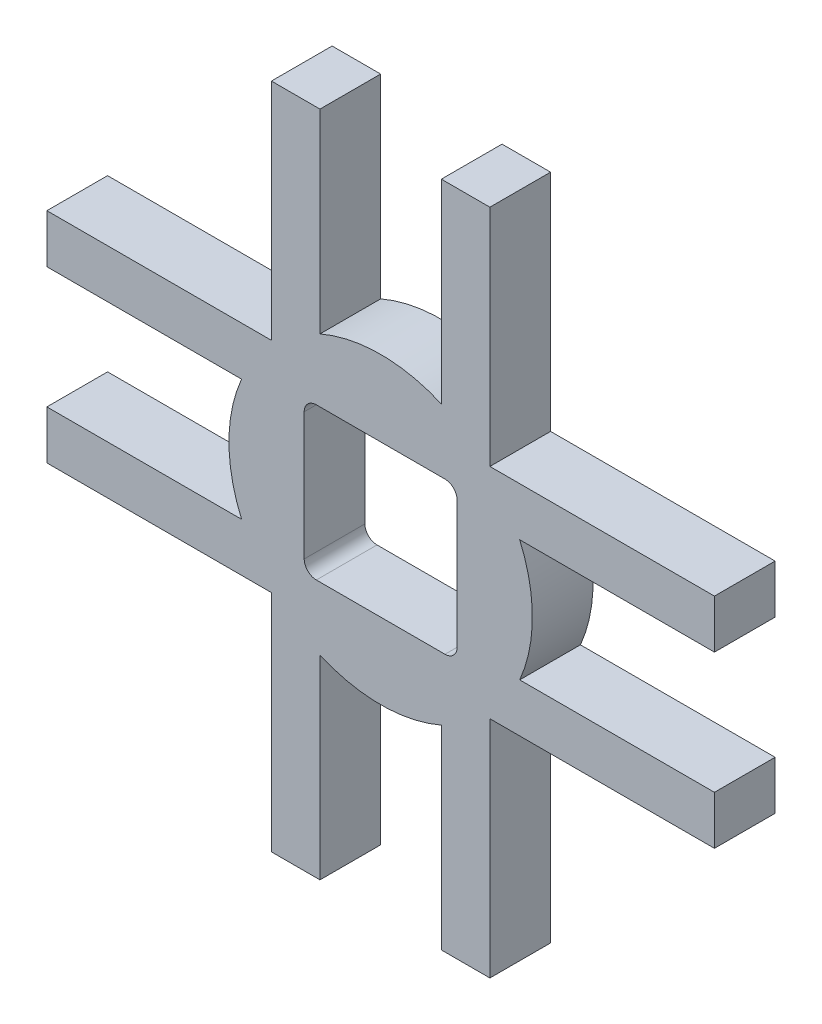
ISO-10303-21;
HEADER;
FILE_DESCRIPTION(('STEP AP214'),'2;1');
FILE_NAME('part.step','',(''),(''),'','','');
FILE_SCHEMA(('AUTOMOTIVE_DESIGN { 1 0 10303 214 1 1 1 1 }'));
ENDSEC;
DATA;
#1=APPLICATION_CONTEXT('core data for automotive mechanical design processes');
#2=APPLICATION_PROTOCOL_DEFINITION('international standard','automotive_design',2000,#1);
#3=PRODUCT_CONTEXT('',#1,'mechanical');
#4=PRODUCT('Part','Part','',(#3));
#5=PRODUCT_RELATED_PRODUCT_CATEGORY('part','',(#4));
#6=PRODUCT_DEFINITION_FORMATION('','',#4);
#7=PRODUCT_DEFINITION_CONTEXT('part definition',#1,'design');
#8=PRODUCT_DEFINITION('design','',#6,#7);
#9=PRODUCT_DEFINITION_SHAPE('','',#8);
#10=(LENGTH_UNIT() NAMED_UNIT(*) SI_UNIT(.MILLI.,.METRE.));
#11=(NAMED_UNIT(*) PLANE_ANGLE_UNIT() SI_UNIT($,.RADIAN.));
#12=(NAMED_UNIT(*) SI_UNIT($,.STERADIAN.) SOLID_ANGLE_UNIT());
#13=UNCERTAINTY_MEASURE_WITH_UNIT(LENGTH_MEASURE(1.E-05),#10,'distance_accuracy_value','');
#14=(GEOMETRIC_REPRESENTATION_CONTEXT(3) GLOBAL_UNCERTAINTY_ASSIGNED_CONTEXT((#13)) GLOBAL_UNIT_ASSIGNED_CONTEXT((#10,
#11,#12)) REPRESENTATION_CONTEXT('',''));
#15=CARTESIAN_POINT('',(0.,0.,0.));
#16=DIRECTION('',(0.,0.,1.));
#17=DIRECTION('',(1.,0.,0.));
#18=AXIS2_PLACEMENT_3D('',#15,#16,#17);
#19=CARTESIAN_POINT('',(0.,0.,2.5));
#20=DIRECTION('',(0.,0.,-1.));
#21=DIRECTION('',(-1.,0.,0.));
#22=AXIS2_PLACEMENT_3D('',#19,#20,#21);
#23=CYLINDRICAL_SURFACE('',#22,12.5);
#24=CARTESIAN_POINT('',(0.,0.,-2.5));
#25=DIRECTION('',(0.,0.,1.));
#26=DIRECTION('',(1.,0.,0.));
#27=AXIS2_PLACEMENT_3D('',#24,#25,#26);
#28=CIRCLE('',#27,12.5);
#29=CARTESIAN_POINT('',(-5.,-11.4564392373896,-2.5));
#30=VERTEX_POINT('',#29);
#31=CARTESIAN_POINT('',(5.,-11.4564392373896,-2.5));
#32=VERTEX_POINT('',#31);
#33=EDGE_CURVE('E481',#30,#32,#28,.T.);
#34=ORIENTED_EDGE('',*,*,#33,.T.);
#35=DIRECTION('',(0.,0.,-1.));
#36=VECTOR('',#35,1.);
#37=CARTESIAN_POINT('',(5.,-11.4564392373896,2.5));
#38=LINE('',#37,#36);
#39=CARTESIAN_POINT('',(5.,-11.4564392373896,2.5));
#40=VERTEX_POINT('',#39);
#41=EDGE_CURVE('E421',#32,#40,#38,.F.);
#42=ORIENTED_EDGE('',*,*,#41,.T.);
#43=CARTESIAN_POINT('',(0.,0.,2.5));
#44=DIRECTION('',(0.,0.,1.));
#45=DIRECTION('',(1.,0.,0.));
#46=AXIS2_PLACEMENT_3D('',#43,#44,#45);
#47=CIRCLE('',#46,12.5);
#48=CARTESIAN_POINT('',(-5.,-11.4564392373896,2.5));
#49=VERTEX_POINT('',#48);
#50=EDGE_CURVE('E477',#49,#40,#47,.T.);
#51=ORIENTED_EDGE('',*,*,#50,.F.);
#52=DIRECTION('',(0.,0.,-1.));
#53=VECTOR('',#52,1.);
#54=CARTESIAN_POINT('',(-5.,-11.4564392373896,2.5));
#55=LINE('',#54,#53);
#56=EDGE_CURVE('E404',#49,#30,#55,.T.);
#57=ORIENTED_EDGE('',*,*,#56,.T.);
#58=EDGE_LOOP('',(#34,#42,#51,#57));
#59=FACE_BOUND('',#58,.T.);
#60=ADVANCED_FACE('F37',(#59),#23,.T.);
#61=CARTESIAN_POINT('',(-11.4564392373896,4.99999999999996,2.5));
#62=VERTEX_POINT('',#61);
#63=CARTESIAN_POINT('',(-11.4564392373896,-5.00000000000004,2.5));
#64=VERTEX_POINT('',#63);
#65=EDGE_CURVE('E474',#62,#64,#47,.T.);
#66=ORIENTED_EDGE('',*,*,#65,.F.);
#67=DIRECTION('',(0.,0.,-1.));
#68=VECTOR('',#67,1.);
#69=CARTESIAN_POINT('',(-11.4564392373896,4.99999999999996,2.5));
#70=LINE('',#69,#68);
#71=CARTESIAN_POINT('',(-11.4564392373896,4.99999999999996,-2.5));
#72=VERTEX_POINT('',#71);
#73=EDGE_CURVE('E329',#62,#72,#70,.T.);
#74=ORIENTED_EDGE('',*,*,#73,.T.);
#75=CARTESIAN_POINT('',(-11.4564392373896,-5.00000000000004,-2.5));
#76=VERTEX_POINT('',#75);
#77=EDGE_CURVE('E479',#72,#76,#28,.T.);
#78=ORIENTED_EDGE('',*,*,#77,.T.);
#79=DIRECTION('',(0.,0.,-1.));
#80=VECTOR('',#79,1.);
#81=CARTESIAN_POINT('',(-11.4564392373896,-5.00000000000004,2.5));
#82=LINE('',#81,#80);
#83=EDGE_CURVE('E424',#76,#64,#82,.F.);
#84=ORIENTED_EDGE('',*,*,#83,.T.);
#85=EDGE_LOOP('',(#66,#74,#78,#84));
#86=FACE_BOUND('',#85,.T.);
#87=ADVANCED_FACE('F575',(#86),#23,.T.);
#88=CARTESIAN_POINT('',(11.4564392373897,-4.99999999999988,-2.5));
#89=VERTEX_POINT('',#88);
#90=CARTESIAN_POINT('',(11.4564392373896,5.00000000000004,-2.5));
#91=VERTEX_POINT('',#90);
#92=EDGE_CURVE('E482',#89,#91,#28,.T.);
#93=ORIENTED_EDGE('',*,*,#92,.T.);
#94=DIRECTION('',(0.,0.,-1.));
#95=VECTOR('',#94,1.);
#96=CARTESIAN_POINT('',(11.4564392373896,5.00000000000004,2.5));
#97=LINE('',#96,#95);
#98=CARTESIAN_POINT('',(11.4564392373896,5.00000000000004,2.5));
#99=VERTEX_POINT('',#98);
#100=EDGE_CURVE('E327',#91,#99,#97,.F.);
#101=ORIENTED_EDGE('',*,*,#100,.T.);
#102=CARTESIAN_POINT('',(11.4564392373897,-4.99999999999988,2.5));
#103=VERTEX_POINT('',#102);
#104=EDGE_CURVE('E279',#103,#99,#47,.T.);
#105=ORIENTED_EDGE('',*,*,#104,.F.);
#106=DIRECTION('',(0.,0.,-1.));
#107=VECTOR('',#106,1.);
#108=CARTESIAN_POINT('',(11.4564392373897,-4.99999999999988,2.5));
#109=LINE('',#108,#107);
#110=EDGE_CURVE('E418',#103,#89,#109,.T.);
#111=ORIENTED_EDGE('',*,*,#110,.T.);
#112=EDGE_LOOP('',(#93,#101,#105,#111));
#113=FACE_BOUND('',#112,.T.);
#114=ADVANCED_FACE('F581',(#113),#23,.T.);
#115=CARTESIAN_POINT('',(5.,11.4564392373896,2.5));
#116=VERTEX_POINT('',#115);
#117=CARTESIAN_POINT('',(-5.,11.4564392373896,2.5));
#118=VERTEX_POINT('',#117);
#119=EDGE_CURVE('E478',#116,#118,#47,.T.);
#120=ORIENTED_EDGE('',*,*,#119,.F.);
#121=DIRECTION('',(0.,0.,-1.));
#122=VECTOR('',#121,1.);
#123=CARTESIAN_POINT('',(5.,11.4564392373896,2.5));
#124=LINE('',#123,#122);
#125=CARTESIAN_POINT('',(5.,11.4564392373896,-2.5));
#126=VERTEX_POINT('',#125);
#127=EDGE_CURVE('E447',#116,#126,#124,.T.);
#128=ORIENTED_EDGE('',*,*,#127,.T.);
#129=CARTESIAN_POINT('',(-5.,11.4564392373896,-2.5));
#130=VERTEX_POINT('',#129);
#131=EDGE_CURVE('E473',#126,#130,#28,.T.);
#132=ORIENTED_EDGE('',*,*,#131,.T.);
#133=DIRECTION('',(0.,0.,-1.));
#134=VECTOR('',#133,1.);
#135=CARTESIAN_POINT('',(-5.,11.4564392373896,2.5));
#136=LINE('',#135,#134);
#137=EDGE_CURVE('E459',#130,#118,#136,.F.);
#138=ORIENTED_EDGE('',*,*,#137,.T.);
#139=EDGE_LOOP('',(#120,#128,#132,#138));
#140=FACE_BOUND('',#139,.T.);
#141=ADVANCED_FACE('F577',(#140),#23,.T.);
#142=CARTESIAN_POINT('',(0.,0.,2.5));
#143=DIRECTION('',(0.,0.,1.));
#144=DIRECTION('',(1.,0.,0.));
#145=AXIS2_PLACEMENT_3D('',#142,#143,#144);
#146=PLANE('',#145);
#147=DIRECTION('',(0.,1.,0.));
#148=VECTOR('',#147,1.);
#149=CARTESIAN_POINT('',(6.3,6.25,2.5));
#150=LINE('',#149,#148);
#151=CARTESIAN_POINT('',(6.3,-5.25,2.5));
#152=VERTEX_POINT('',#151);
#153=CARTESIAN_POINT('',(6.3,5.25,2.5));
#154=VERTEX_POINT('',#153);
#155=EDGE_CURVE('E538',#152,#154,#150,.T.);
#156=ORIENTED_EDGE('',*,*,#155,.F.);
#157=CARTESIAN_POINT('',(5.3,-5.25,2.5));
#158=DIRECTION('',(0.,0.,1.));
#159=DIRECTION('',(1.,0.,0.));
#160=AXIS2_PLACEMENT_3D('',#157,#158,#159);
#161=CIRCLE('',#160,1.);
#162=CARTESIAN_POINT('',(5.3,-6.25,2.5));
#163=VERTEX_POINT('',#162);
#164=EDGE_CURVE('E52',#152,#163,#161,.F.);
#165=ORIENTED_EDGE('',*,*,#164,.T.);
#166=DIRECTION('',(1.,0.,0.));
#167=VECTOR('',#166,1.);
#168=CARTESIAN_POINT('',(-6.3,-6.25,2.5));
#169=LINE('',#168,#167);
#170=CARTESIAN_POINT('',(-5.3,-6.25,2.5));
#171=VERTEX_POINT('',#170);
#172=EDGE_CURVE('E301',#171,#163,#169,.T.);
#173=ORIENTED_EDGE('',*,*,#172,.F.);
#174=CARTESIAN_POINT('',(-5.3,-5.25,2.5));
#175=DIRECTION('',(0.,0.,1.));
#176=DIRECTION('',(1.,0.,0.));
#177=AXIS2_PLACEMENT_3D('',#174,#175,#176);
#178=CIRCLE('',#177,1.);
#179=CARTESIAN_POINT('',(-6.3,-5.25,2.5));
#180=VERTEX_POINT('',#179);
#181=EDGE_CURVE('E45',#171,#180,#178,.F.);
#182=ORIENTED_EDGE('',*,*,#181,.T.);
#183=DIRECTION('',(0.,-1.,0.));
#184=VECTOR('',#183,1.);
#185=CARTESIAN_POINT('',(-6.3,6.25,2.5));
#186=LINE('',#185,#184);
#187=CARTESIAN_POINT('',(-6.3,5.25,2.5));
#188=VERTEX_POINT('',#187);
#189=EDGE_CURVE('E515',#188,#180,#186,.T.);
#190=ORIENTED_EDGE('',*,*,#189,.F.);
#191=CARTESIAN_POINT('',(-5.3,5.25,2.5));
#192=DIRECTION('',(0.,0.,1.));
#193=DIRECTION('',(1.,0.,0.));
#194=AXIS2_PLACEMENT_3D('',#191,#192,#193);
#195=CIRCLE('',#194,1.);
#196=CARTESIAN_POINT('',(-5.3,6.25,2.5));
#197=VERTEX_POINT('',#196);
#198=EDGE_CURVE('E503',#188,#197,#195,.F.);
#199=ORIENTED_EDGE('',*,*,#198,.T.);
#200=DIRECTION('',(-1.,0.,0.));
#201=VECTOR('',#200,1.);
#202=CARTESIAN_POINT('',(-6.3,6.25,2.5));
#203=LINE('',#202,#201);
#204=CARTESIAN_POINT('',(5.3,6.25,2.5));
#205=VERTEX_POINT('',#204);
#206=EDGE_CURVE('E521',#205,#197,#203,.T.);
#207=ORIENTED_EDGE('',*,*,#206,.F.);
#208=CARTESIAN_POINT('',(5.3,5.25,2.5));
#209=DIRECTION('',(0.,0.,1.));
#210=DIRECTION('',(1.,0.,0.));
#211=AXIS2_PLACEMENT_3D('',#208,#209,#210);
#212=CIRCLE('',#211,1.);
#213=EDGE_CURVE('E507',#205,#154,#212,.F.);
#214=ORIENTED_EDGE('',*,*,#213,.T.);
#215=EDGE_LOOP('',(#156,#165,#173,#182,#190,#199,#207,#214));
#216=FACE_BOUND('',#215,.T.);
#217=DIRECTION('',(1.,0.,0.));
#218=VECTOR('',#217,1.);
#219=CARTESIAN_POINT('',(0.,5.,2.5));
#220=LINE('',#219,#218);
#221=CARTESIAN_POINT('',(-27.5,4.9999999999999,2.5));
#222=VERTEX_POINT('',#221);
#223=EDGE_CURVE('E282',#222,#62,#220,.T.);
#224=ORIENTED_EDGE('',*,*,#223,.T.);
#225=ORIENTED_EDGE('',*,*,#65,.T.);
#226=DIRECTION('',(-1.,0.,0.));
#227=VECTOR('',#226,1.);
#228=CARTESIAN_POINT('',(0.,-5.,2.5));
#229=LINE('',#228,#227);
#230=CARTESIAN_POINT('',(-27.5,-5.0000000000001,2.5));
#231=VERTEX_POINT('',#230);
#232=EDGE_CURVE('E407',#64,#231,#229,.T.);
#233=ORIENTED_EDGE('',*,*,#232,.T.);
#234=DIRECTION('',(0.,-1.,0.));
#235=VECTOR('',#234,1.);
#236=CARTESIAN_POINT('',(-27.5,-9.0000000000001,2.5));
#237=LINE('',#236,#235);
#238=CARTESIAN_POINT('',(-27.5,-9.0000000000001,2.5));
#239=VERTEX_POINT('',#238);
#240=EDGE_CURVE('E409',#231,#239,#237,.T.);
#241=ORIENTED_EDGE('',*,*,#240,.T.);
#242=DIRECTION('',(1.,0.,0.));
#243=VECTOR('',#242,1.);
#244=CARTESIAN_POINT('',(0.,-9.,2.5));
#245=LINE('',#244,#243);
#246=CARTESIAN_POINT('',(-9.,-9.00000000000002,2.5));
#247=VERTEX_POINT('',#246);
#248=EDGE_CURVE('E384',#239,#247,#245,.T.);
#249=ORIENTED_EDGE('',*,*,#248,.T.);
#250=DIRECTION('',(0.,-1.,0.));
#251=VECTOR('',#250,1.);
#252=CARTESIAN_POINT('',(-9.,0.,2.5));
#253=LINE('',#252,#251);
#254=CARTESIAN_POINT('',(-9.,-27.5,2.5));
#255=VERTEX_POINT('',#254);
#256=EDGE_CURVE('E332',#247,#255,#253,.T.);
#257=ORIENTED_EDGE('',*,*,#256,.T.);
#258=DIRECTION('',(1.,0.,0.));
#259=VECTOR('',#258,1.);
#260=CARTESIAN_POINT('',(-9.,-27.5,2.5));
#261=LINE('',#260,#259);
#262=CARTESIAN_POINT('',(-5.,-27.5,2.5));
#263=VERTEX_POINT('',#262);
#264=EDGE_CURVE('E340',#255,#263,#261,.T.);
#265=ORIENTED_EDGE('',*,*,#264,.T.);
#266=DIRECTION('',(0.,1.,0.));
#267=VECTOR('',#266,1.);
#268=CARTESIAN_POINT('',(-5.,0.,2.5));
#269=LINE('',#268,#267);
#270=EDGE_CURVE('E343',#263,#49,#269,.T.);
#271=ORIENTED_EDGE('',*,*,#270,.T.);
#272=ORIENTED_EDGE('',*,*,#50,.T.);
#273=DIRECTION('',(0.,-1.,0.));
#274=VECTOR('',#273,1.);
#275=CARTESIAN_POINT('',(5.,0.,2.5));
#276=LINE('',#275,#274);
#277=CARTESIAN_POINT('',(5.,-27.5,2.5));
#278=VERTEX_POINT('',#277);
#279=EDGE_CURVE('E387',#40,#278,#276,.T.);
#280=ORIENTED_EDGE('',*,*,#279,.T.);
#281=DIRECTION('',(1.,0.,0.));
#282=VECTOR('',#281,1.);
#283=CARTESIAN_POINT('',(9.,-27.5,2.5));
#284=LINE('',#283,#282);
#285=CARTESIAN_POINT('',(9.,-27.5,2.5));
#286=VERTEX_POINT('',#285);
#287=EDGE_CURVE('E389',#278,#286,#284,.T.);
#288=ORIENTED_EDGE('',*,*,#287,.T.);
#289=DIRECTION('',(0.,1.,0.));
#290=VECTOR('',#289,1.);
#291=CARTESIAN_POINT('',(9.,0.,2.5));
#292=LINE('',#291,#290);
#293=CARTESIAN_POINT('',(9.,-8.9999999999999,2.5));
#294=VERTEX_POINT('',#293);
#295=EDGE_CURVE('E375',#286,#294,#292,.T.);
#296=ORIENTED_EDGE('',*,*,#295,.T.);
#297=DIRECTION('',(1.,0.,0.));
#298=VECTOR('',#297,1.);
#299=CARTESIAN_POINT('',(0.,-9.,2.5));
#300=LINE('',#299,#298);
#301=CARTESIAN_POINT('',(27.5000000000001,-8.99999999999971,2.5));
#302=VERTEX_POINT('',#301);
#303=EDGE_CURVE('E354',#294,#302,#300,.T.);
#304=ORIENTED_EDGE('',*,*,#303,.T.);
#305=DIRECTION('',(0.,1.,0.));
#306=VECTOR('',#305,1.);
#307=CARTESIAN_POINT('',(27.5000000000001,-8.99999999999971,2.5));
#308=LINE('',#307,#306);
#309=CARTESIAN_POINT('',(27.5000000000001,-4.99999999999971,2.5));
#310=VERTEX_POINT('',#309);
#311=EDGE_CURVE('E362',#302,#310,#308,.T.);
#312=ORIENTED_EDGE('',*,*,#311,.T.);
#313=DIRECTION('',(-1.,0.,0.));
#314=VECTOR('',#313,1.);
#315=CARTESIAN_POINT('',(0.,-5.,2.5));
#316=LINE('',#315,#314);
#317=EDGE_CURVE('E365',#310,#103,#316,.T.);
#318=ORIENTED_EDGE('',*,*,#317,.T.);
#319=ORIENTED_EDGE('',*,*,#104,.T.);
#320=CARTESIAN_POINT('',(27.4999999999999,5.00000000000029,2.5));
#321=VERTEX_POINT('',#320);
#322=EDGE_CURVE('E270',#99,#321,#220,.T.);
#323=ORIENTED_EDGE('',*,*,#322,.T.);
#324=DIRECTION('',(0.,1.,0.));
#325=VECTOR('',#324,1.);
#326=CARTESIAN_POINT('',(27.4999999999999,9.00000000000029,2.5));
#327=LINE('',#326,#325);
#328=CARTESIAN_POINT('',(27.4999999999999,9.00000000000029,2.5));
#329=VERTEX_POINT('',#328);
#330=EDGE_CURVE('E276',#321,#329,#327,.T.);
#331=ORIENTED_EDGE('',*,*,#330,.T.);
#332=DIRECTION('',(-1.,0.,0.));
#333=VECTOR('',#332,1.);
#334=CARTESIAN_POINT('',(0.,9.,2.5));
#335=LINE('',#334,#333);
#336=CARTESIAN_POINT('',(9.,9.00000000000003,2.5));
#337=VERTEX_POINT('',#336);
#338=EDGE_CURVE('E313',#329,#337,#335,.T.);
#339=ORIENTED_EDGE('',*,*,#338,.T.);
#340=DIRECTION('',(0.,1.,0.));
#341=VECTOR('',#340,1.);
#342=CARTESIAN_POINT('',(9.,0.,2.5));
#343=LINE('',#342,#341);
#344=CARTESIAN_POINT('',(9.,27.5,2.5));
#345=VERTEX_POINT('',#344);
#346=EDGE_CURVE('E427',#337,#345,#343,.T.);
#347=ORIENTED_EDGE('',*,*,#346,.T.);
#348=DIRECTION('',(-1.,0.,0.));
#349=VECTOR('',#348,1.);
#350=CARTESIAN_POINT('',(9.,27.5,2.5));
#351=LINE('',#350,#349);
#352=CARTESIAN_POINT('',(5.,27.5,2.5));
#353=VERTEX_POINT('',#352);
#354=EDGE_CURVE('E436',#345,#353,#351,.T.);
#355=ORIENTED_EDGE('',*,*,#354,.T.);
#356=DIRECTION('',(0.,-1.,0.));
#357=VECTOR('',#356,1.);
#358=CARTESIAN_POINT('',(5.,0.,2.5));
#359=LINE('',#358,#357);
#360=EDGE_CURVE('E439',#353,#116,#359,.T.);
#361=ORIENTED_EDGE('',*,*,#360,.T.);
#362=ORIENTED_EDGE('',*,*,#119,.T.);
#363=DIRECTION('',(0.,1.,0.));
#364=VECTOR('',#363,1.);
#365=CARTESIAN_POINT('',(-5.,0.,2.5));
#366=LINE('',#365,#364);
#367=CARTESIAN_POINT('',(-5.,27.5,2.5));
#368=VERTEX_POINT('',#367);
#369=EDGE_CURVE('E462',#118,#368,#366,.T.);
#370=ORIENTED_EDGE('',*,*,#369,.T.);
#371=DIRECTION('',(-1.,0.,0.));
#372=VECTOR('',#371,1.);
#373=CARTESIAN_POINT('',(-9.,27.5,2.5));
#374=LINE('',#373,#372);
#375=CARTESIAN_POINT('',(-9.,27.5,2.5));
#376=VERTEX_POINT('',#375);
#377=EDGE_CURVE('E464',#368,#376,#374,.T.);
#378=ORIENTED_EDGE('',*,*,#377,.T.);
#379=DIRECTION('',(0.,-1.,0.));
#380=VECTOR('',#379,1.);
#381=CARTESIAN_POINT('',(-9.,0.,2.5));
#382=LINE('',#381,#380);
#383=CARTESIAN_POINT('',(-9.,8.99999999999997,2.5));
#384=VERTEX_POINT('',#383);
#385=EDGE_CURVE('E450',#376,#384,#382,.T.);
#386=ORIENTED_EDGE('',*,*,#385,.T.);
#387=CARTESIAN_POINT('',(-27.5,8.99999999999991,2.5));
#388=VERTEX_POINT('',#387);
#389=EDGE_CURVE('E315',#384,#388,#335,.T.);
#390=ORIENTED_EDGE('',*,*,#389,.T.);
#391=DIRECTION('',(0.,-1.,0.));
#392=VECTOR('',#391,1.);
#393=CARTESIAN_POINT('',(-27.5,8.99999999999991,2.5));
#394=LINE('',#393,#392);
#395=EDGE_CURVE('E283',#388,#222,#394,.T.);
#396=ORIENTED_EDGE('',*,*,#395,.T.);
#397=EDGE_LOOP('',(#224,#225,#233,#241,#249,#257,#265,#271,#272,#280,#288,#296,#304,#312,#318,
#319,#323,#331,#339,#347,#355,#361,#362,#370,#378,#386,#390,#396));
#398=FACE_BOUND('',#397,.T.);
#399=ADVANCED_FACE('F273',(#216,#398),#146,.T.);
#400=CARTESIAN_POINT('',(0.,0.,-2.5));
#401=DIRECTION('',(0.,0.,1.));
#402=DIRECTION('',(1.,0.,0.));
#403=AXIS2_PLACEMENT_3D('',#400,#401,#402);
#404=PLANE('',#403);
#405=DIRECTION('',(-1.,0.,0.));
#406=VECTOR('',#405,1.);
#407=CARTESIAN_POINT('',(-6.3,-6.25,-2.5));
#408=LINE('',#407,#406);
#409=CARTESIAN_POINT('',(5.3,-6.25,-2.5));
#410=VERTEX_POINT('',#409);
#411=CARTESIAN_POINT('',(-5.3,-6.25,-2.5));
#412=VERTEX_POINT('',#411);
#413=EDGE_CURVE('E529',#410,#412,#408,.T.);
#414=ORIENTED_EDGE('',*,*,#413,.F.);
#415=CARTESIAN_POINT('',(5.3,-5.25,-2.5));
#416=DIRECTION('',(0.,0.,1.));
#417=DIRECTION('',(1.,0.,0.));
#418=AXIS2_PLACEMENT_3D('',#415,#416,#417);
#419=CIRCLE('',#418,1.);
#420=CARTESIAN_POINT('',(6.3,-5.25,-2.5));
#421=VERTEX_POINT('',#420);
#422=EDGE_CURVE('E512',#410,#421,#419,.T.);
#423=ORIENTED_EDGE('',*,*,#422,.T.);
#424=DIRECTION('',(0.,-1.,0.));
#425=VECTOR('',#424,1.);
#426=CARTESIAN_POINT('',(6.3,6.25,-2.5));
#427=LINE('',#426,#425);
#428=CARTESIAN_POINT('',(6.3,5.25,-2.5));
#429=VERTEX_POINT('',#428);
#430=EDGE_CURVE('E535',#429,#421,#427,.T.);
#431=ORIENTED_EDGE('',*,*,#430,.F.);
#432=CARTESIAN_POINT('',(5.3,5.25,-2.5));
#433=DIRECTION('',(0.,0.,1.));
#434=DIRECTION('',(1.,0.,0.));
#435=AXIS2_PLACEMENT_3D('',#432,#433,#434);
#436=CIRCLE('',#435,1.);
#437=CARTESIAN_POINT('',(5.3,6.25,-2.5));
#438=VERTEX_POINT('',#437);
#439=EDGE_CURVE('E509',#429,#438,#436,.T.);
#440=ORIENTED_EDGE('',*,*,#439,.T.);
#441=DIRECTION('',(1.,0.,0.));
#442=VECTOR('',#441,1.);
#443=CARTESIAN_POINT('',(-6.3,6.25,-2.5));
#444=LINE('',#443,#442);
#445=CARTESIAN_POINT('',(-5.3,6.25,-2.5));
#446=VERTEX_POINT('',#445);
#447=EDGE_CURVE('E298',#446,#438,#444,.T.);
#448=ORIENTED_EDGE('',*,*,#447,.F.);
#449=CARTESIAN_POINT('',(-5.3,5.25,-2.5));
#450=DIRECTION('',(0.,0.,1.));
#451=DIRECTION('',(1.,0.,0.));
#452=AXIS2_PLACEMENT_3D('',#449,#450,#451);
#453=CIRCLE('',#452,1.);
#454=CARTESIAN_POINT('',(-6.3,5.25,-2.5));
#455=VERTEX_POINT('',#454);
#456=EDGE_CURVE('E505',#446,#455,#453,.T.);
#457=ORIENTED_EDGE('',*,*,#456,.T.);
#458=DIRECTION('',(0.,1.,0.));
#459=VECTOR('',#458,1.);
#460=CARTESIAN_POINT('',(-6.3,6.25,-2.5));
#461=LINE('',#460,#459);
#462=CARTESIAN_POINT('',(-6.3,-5.25,-2.5));
#463=VERTEX_POINT('',#462);
#464=EDGE_CURVE('E531',#463,#455,#461,.T.);
#465=ORIENTED_EDGE('',*,*,#464,.F.);
#466=CARTESIAN_POINT('',(-5.3,-5.25,-2.5));
#467=DIRECTION('',(0.,0.,1.));
#468=DIRECTION('',(1.,0.,0.));
#469=AXIS2_PLACEMENT_3D('',#466,#467,#468);
#470=CIRCLE('',#469,1.);
#471=EDGE_CURVE('E11',#463,#412,#470,.T.);
#472=ORIENTED_EDGE('',*,*,#471,.T.);
#473=EDGE_LOOP('',(#414,#423,#431,#440,#448,#457,#465,#472));
#474=FACE_BOUND('',#473,.T.);
#475=ORIENTED_EDGE('',*,*,#77,.F.);
#476=DIRECTION('',(-1.,0.,0.));
#477=VECTOR('',#476,1.);
#478=CARTESIAN_POINT('',(0.,5.,-2.5));
#479=LINE('',#478,#477);
#480=CARTESIAN_POINT('',(-27.5,4.9999999999999,-2.5));
#481=VERTEX_POINT('',#480);
#482=EDGE_CURVE('E309',#72,#481,#479,.T.);
#483=ORIENTED_EDGE('',*,*,#482,.T.);
#484=DIRECTION('',(0.,1.,0.));
#485=VECTOR('',#484,1.);
#486=CARTESIAN_POINT('',(-27.5,8.99999999999991,-2.5));
#487=LINE('',#486,#485);
#488=CARTESIAN_POINT('',(-27.5,8.99999999999991,-2.5));
#489=VERTEX_POINT('',#488);
#490=EDGE_CURVE('E312',#481,#489,#487,.T.);
#491=ORIENTED_EDGE('',*,*,#490,.T.);
#492=DIRECTION('',(1.,0.,0.));
#493=VECTOR('',#492,1.);
#494=CARTESIAN_POINT('',(0.,9.,-2.5));
#495=LINE('',#494,#493);
#496=CARTESIAN_POINT('',(-9.,9.00000000000029,-2.5));
#497=VERTEX_POINT('',#496);
#498=EDGE_CURVE('E310',#489,#497,#495,.T.);
#499=ORIENTED_EDGE('',*,*,#498,.T.);
#500=DIRECTION('',(0.,1.,0.));
#501=VECTOR('',#500,1.);
#502=CARTESIAN_POINT('',(-9.,0.,-2.5));
#503=LINE('',#502,#501);
#504=CARTESIAN_POINT('',(-9.,27.5,-2.5));
#505=VERTEX_POINT('',#504);
#506=EDGE_CURVE('E457',#497,#505,#503,.T.);
#507=ORIENTED_EDGE('',*,*,#506,.T.);
#508=DIRECTION('',(1.,0.,0.));
#509=VECTOR('',#508,1.);
#510=CARTESIAN_POINT('',(-9.,27.5,-2.5));
#511=LINE('',#510,#509);
#512=CARTESIAN_POINT('',(-5.,27.5,-2.5));
#513=VERTEX_POINT('',#512);
#514=EDGE_CURVE('E454',#505,#513,#511,.T.);
#515=ORIENTED_EDGE('',*,*,#514,.T.);
#516=DIRECTION('',(0.,-1.,0.));
#517=VECTOR('',#516,1.);
#518=CARTESIAN_POINT('',(-5.,0.,-2.5));
#519=LINE('',#518,#517);
#520=EDGE_CURVE('E451',#513,#130,#519,.T.);
#521=ORIENTED_EDGE('',*,*,#520,.T.);
#522=ORIENTED_EDGE('',*,*,#131,.F.);
#523=DIRECTION('',(0.,1.,0.));
#524=VECTOR('',#523,1.);
#525=CARTESIAN_POINT('',(5.,0.,-2.5));
#526=LINE('',#525,#524);
#527=CARTESIAN_POINT('',(5.,27.5,-2.5));
#528=VERTEX_POINT('',#527);
#529=EDGE_CURVE('E428',#126,#528,#526,.T.);
#530=ORIENTED_EDGE('',*,*,#529,.T.);
#531=DIRECTION('',(1.,0.,0.));
#532=VECTOR('',#531,1.);
#533=CARTESIAN_POINT('',(9.,27.5,-2.5));
#534=LINE('',#533,#532);
#535=CARTESIAN_POINT('',(9.,27.5,-2.5));
#536=VERTEX_POINT('',#535);
#537=EDGE_CURVE('E434',#528,#536,#534,.T.);
#538=ORIENTED_EDGE('',*,*,#537,.T.);
#539=DIRECTION('',(0.,-1.,0.));
#540=VECTOR('',#539,1.);
#541=CARTESIAN_POINT('',(9.,0.,-2.5));
#542=LINE('',#541,#540);
#543=CARTESIAN_POINT('',(9.,9.00000000000003,-2.5));
#544=VERTEX_POINT('',#543);
#545=EDGE_CURVE('E430',#536,#544,#542,.T.);
#546=ORIENTED_EDGE('',*,*,#545,.T.);
#547=CARTESIAN_POINT('',(27.4999999999999,9.00000000000029,-2.5));
#548=VERTEX_POINT('',#547);
#549=EDGE_CURVE('E308',#544,#548,#495,.T.);
#550=ORIENTED_EDGE('',*,*,#549,.T.);
#551=DIRECTION('',(0.,-1.,0.));
#552=VECTOR('',#551,1.);
#553=CARTESIAN_POINT('',(27.4999999999999,9.00000000000029,-2.5));
#554=LINE('',#553,#552);
#555=CARTESIAN_POINT('',(27.4999999999999,5.00000000000029,-2.5));
#556=VERTEX_POINT('',#555);
#557=EDGE_CURVE('E305',#548,#556,#554,.T.);
#558=ORIENTED_EDGE('',*,*,#557,.T.);
#559=EDGE_CURVE('E289',#556,#91,#479,.T.);
#560=ORIENTED_EDGE('',*,*,#559,.T.);
#561=ORIENTED_EDGE('',*,*,#92,.F.);
#562=DIRECTION('',(1.,0.,0.));
#563=VECTOR('',#562,1.);
#564=CARTESIAN_POINT('',(0.,-5.,-2.5));
#565=LINE('',#564,#563);
#566=CARTESIAN_POINT('',(27.5000000000001,-4.99999999999971,-2.5));
#567=VERTEX_POINT('',#566);
#568=EDGE_CURVE('E355',#89,#567,#565,.T.);
#569=ORIENTED_EDGE('',*,*,#568,.T.);
#570=DIRECTION('',(0.,-1.,0.));
#571=VECTOR('',#570,1.);
#572=CARTESIAN_POINT('',(27.5000000000001,-8.99999999999971,-2.5));
#573=LINE('',#572,#571);
#574=CARTESIAN_POINT('',(27.5000000000001,-8.99999999999971,-2.5));
#575=VERTEX_POINT('',#574);
#576=EDGE_CURVE('E360',#567,#575,#573,.T.);
#577=ORIENTED_EDGE('',*,*,#576,.T.);
#578=DIRECTION('',(-1.,0.,0.));
#579=VECTOR('',#578,1.);
#580=CARTESIAN_POINT('',(0.,-9.,-2.5));
#581=LINE('',#580,#579);
#582=CARTESIAN_POINT('',(9.,-8.99999999999993,-2.5));
#583=VERTEX_POINT('',#582);
#584=EDGE_CURVE('E357',#575,#583,#581,.T.);
#585=ORIENTED_EDGE('',*,*,#584,.T.);
#586=DIRECTION('',(0.,-1.,0.));
#587=VECTOR('',#586,1.);
#588=CARTESIAN_POINT('',(9.,0.,-2.5));
#589=LINE('',#588,#587);
#590=CARTESIAN_POINT('',(9.,-27.5,-2.5));
#591=VERTEX_POINT('',#590);
#592=EDGE_CURVE('E382',#583,#591,#589,.T.);
#593=ORIENTED_EDGE('',*,*,#592,.T.);
#594=DIRECTION('',(-1.,0.,0.));
#595=VECTOR('',#594,1.);
#596=CARTESIAN_POINT('',(9.,-27.5,-2.5));
#597=LINE('',#596,#595);
#598=CARTESIAN_POINT('',(5.,-27.5,-2.5));
#599=VERTEX_POINT('',#598);
#600=EDGE_CURVE('E379',#591,#599,#597,.T.);
#601=ORIENTED_EDGE('',*,*,#600,.T.);
#602=DIRECTION('',(0.,1.,0.));
#603=VECTOR('',#602,1.);
#604=CARTESIAN_POINT('',(5.,0.,-2.5));
#605=LINE('',#604,#603);
#606=EDGE_CURVE('E376',#599,#32,#605,.T.);
#607=ORIENTED_EDGE('',*,*,#606,.T.);
#608=ORIENTED_EDGE('',*,*,#33,.F.);
#609=DIRECTION('',(0.,-1.,0.));
#610=VECTOR('',#609,1.);
#611=CARTESIAN_POINT('',(-5.,0.,-2.5));
#612=LINE('',#611,#610);
#613=CARTESIAN_POINT('',(-5.,-27.5,-2.5));
#614=VERTEX_POINT('',#613);
#615=EDGE_CURVE('E333',#30,#614,#612,.T.);
#616=ORIENTED_EDGE('',*,*,#615,.T.);
#617=DIRECTION('',(-1.,0.,0.));
#618=VECTOR('',#617,1.);
#619=CARTESIAN_POINT('',(-9.,-27.5,-2.5));
#620=LINE('',#619,#618);
#621=CARTESIAN_POINT('',(-9.,-27.5,-2.5));
#622=VERTEX_POINT('',#621);
#623=EDGE_CURVE('E338',#614,#622,#620,.T.);
#624=ORIENTED_EDGE('',*,*,#623,.T.);
#625=DIRECTION('',(0.,1.,0.));
#626=VECTOR('',#625,1.);
#627=CARTESIAN_POINT('',(-9.,0.,-2.5));
#628=LINE('',#627,#626);
#629=CARTESIAN_POINT('',(-9.,-9.00000000000003,-2.5));
#630=VERTEX_POINT('',#629);
#631=EDGE_CURVE('E335',#622,#630,#628,.T.);
#632=ORIENTED_EDGE('',*,*,#631,.T.);
#633=DIRECTION('',(-1.,0.,0.));
#634=VECTOR('',#633,1.);
#635=CARTESIAN_POINT('',(0.,-9.,-2.5));
#636=LINE('',#635,#634);
#637=CARTESIAN_POINT('',(-27.5,-9.0000000000001,-2.5));
#638=VERTEX_POINT('',#637);
#639=EDGE_CURVE('E402',#630,#638,#636,.T.);
#640=ORIENTED_EDGE('',*,*,#639,.T.);
#641=DIRECTION('',(0.,1.,0.));
#642=VECTOR('',#641,1.);
#643=CARTESIAN_POINT('',(-27.5,-9.0000000000001,-2.5));
#644=LINE('',#643,#642);
#645=CARTESIAN_POINT('',(-27.5,-5.0000000000001,-2.5));
#646=VERTEX_POINT('',#645);
#647=EDGE_CURVE('E399',#638,#646,#644,.T.);
#648=ORIENTED_EDGE('',*,*,#647,.T.);
#649=DIRECTION('',(1.,0.,0.));
#650=VECTOR('',#649,1.);
#651=CARTESIAN_POINT('',(0.,-5.,-2.5));
#652=LINE('',#651,#650);
#653=EDGE_CURVE('E396',#646,#76,#652,.T.);
#654=ORIENTED_EDGE('',*,*,#653,.T.);
#655=EDGE_LOOP('',(#475,#483,#491,#499,#507,#515,#521,#522,#530,#538,#546,#550,#558,#560,#561,
#569,#577,#585,#593,#601,#607,#608,#616,#624,#632,#640,#648,#654));
#656=FACE_BOUND('',#655,.T.);
#657=ADVANCED_FACE('F527',(#474,#656),#404,.F.);
#658=CARTESIAN_POINT('',(-9.,0.,-30.2893864631805));
#659=DIRECTION('',(-1.,0.,0.));
#660=DIRECTION('',(0.,-1.,0.));
#661=AXIS2_PLACEMENT_3D('',#658,#659,#660);
#662=PLANE('',#661);
#663=DIRECTION('',(0.,0.,-1.));
#664=VECTOR('',#663,1.);
#665=CARTESIAN_POINT('',(-9.,8.99999999999997,-30.2893864631805));
#666=LINE('',#665,#664);
#667=EDGE_CURVE('E324',#384,#497,#666,.T.);
#668=ORIENTED_EDGE('',*,*,#667,.F.);
#669=ORIENTED_EDGE('',*,*,#385,.F.);
#670=DIRECTION('',(0.,0.,1.));
#671=VECTOR('',#670,1.);
#672=CARTESIAN_POINT('',(-9.,27.5,-30.2893864631805));
#673=LINE('',#672,#671);
#674=EDGE_CURVE('E455',#505,#376,#673,.T.);
#675=ORIENTED_EDGE('',*,*,#674,.F.);
#676=ORIENTED_EDGE('',*,*,#506,.F.);
#677=EDGE_LOOP('',(#668,#669,#675,#676));
#678=FACE_BOUND('',#677,.T.);
#679=ADVANCED_FACE('F699',(#678),#662,.T.);
#680=CARTESIAN_POINT('',(-5.,0.,-30.2893864631805));
#681=DIRECTION('',(1.,0.,0.));
#682=DIRECTION('',(0.,0.,-1.));
#683=AXIS2_PLACEMENT_3D('',#680,#681,#682);
#684=PLANE('',#683);
#685=ORIENTED_EDGE('',*,*,#137,.F.);
#686=ORIENTED_EDGE('',*,*,#520,.F.);
#687=DIRECTION('',(0.,0.,1.));
#688=VECTOR('',#687,1.);
#689=CARTESIAN_POINT('',(-5.,27.5,-30.2893864631805));
#690=LINE('',#689,#688);
#691=EDGE_CURVE('E467',#513,#368,#690,.T.);
#692=ORIENTED_EDGE('',*,*,#691,.T.);
#693=ORIENTED_EDGE('',*,*,#369,.F.);
#694=EDGE_LOOP('',(#685,#686,#692,#693));
#695=FACE_BOUND('',#694,.T.);
#696=ADVANCED_FACE('F690',(#695),#684,.T.);
#697=CARTESIAN_POINT('',(-9.,27.5,-30.2893864631805));
#698=DIRECTION('',(0.,1.,0.));
#699=DIRECTION('',(0.,0.,1.));
#700=AXIS2_PLACEMENT_3D('',#697,#698,#699);
#701=PLANE('',#700);
#702=ORIENTED_EDGE('',*,*,#514,.F.);
#703=ORIENTED_EDGE('',*,*,#674,.T.);
#704=ORIENTED_EDGE('',*,*,#377,.F.);
#705=ORIENTED_EDGE('',*,*,#691,.F.);
#706=EDGE_LOOP('',(#702,#703,#704,#705));
#707=FACE_BOUND('',#706,.T.);
#708=ADVANCED_FACE('F696',(#707),#701,.T.);
#709=CARTESIAN_POINT('',(9.,0.,-30.2893864631805));
#710=DIRECTION('',(1.,0.,0.));
#711=DIRECTION('',(0.,1.,0.));
#712=AXIS2_PLACEMENT_3D('',#709,#710,#711);
#713=PLANE('',#712);
#714=DIRECTION('',(0.,0.,1.));
#715=VECTOR('',#714,1.);
#716=CARTESIAN_POINT('',(9.,9.00000000000003,-30.2893864631805));
#717=LINE('',#716,#715);
#718=EDGE_CURVE('E476',#544,#337,#717,.T.);
#719=ORIENTED_EDGE('',*,*,#718,.F.);
#720=ORIENTED_EDGE('',*,*,#545,.F.);
#721=DIRECTION('',(0.,0.,1.));
#722=VECTOR('',#721,1.);
#723=CARTESIAN_POINT('',(9.,27.5,-30.2893864631805));
#724=LINE('',#723,#722);
#725=EDGE_CURVE('E442',#536,#345,#724,.T.);
#726=ORIENTED_EDGE('',*,*,#725,.T.);
#727=ORIENTED_EDGE('',*,*,#346,.F.);
#728=EDGE_LOOP('',(#719,#720,#726,#727));
#729=FACE_BOUND('',#728,.T.);
#730=ADVANCED_FACE('F611',(#729),#713,.T.);
#731=CARTESIAN_POINT('',(5.,0.,-30.2893864631805));
#732=DIRECTION('',(-1.,0.,0.));
#733=DIRECTION('',(0.,0.,1.));
#734=AXIS2_PLACEMENT_3D('',#731,#732,#733);
#735=PLANE('',#734);
#736=ORIENTED_EDGE('',*,*,#127,.F.);
#737=ORIENTED_EDGE('',*,*,#360,.F.);
#738=DIRECTION('',(0.,0.,1.));
#739=VECTOR('',#738,1.);
#740=CARTESIAN_POINT('',(5.,27.5,-30.2893864631805));
#741=LINE('',#740,#739);
#742=EDGE_CURVE('E431',#528,#353,#741,.T.);
#743=ORIENTED_EDGE('',*,*,#742,.F.);
#744=ORIENTED_EDGE('',*,*,#529,.F.);
#745=EDGE_LOOP('',(#736,#737,#743,#744));
#746=FACE_BOUND('',#745,.T.);
#747=ADVANCED_FACE('F599',(#746),#735,.T.);
#748=CARTESIAN_POINT('',(9.,27.5,-30.2893864631805));
#749=DIRECTION('',(0.,1.,0.));
#750=DIRECTION('',(0.,0.,1.));
#751=AXIS2_PLACEMENT_3D('',#748,#749,#750);
#752=PLANE('',#751);
#753=ORIENTED_EDGE('',*,*,#537,.F.);
#754=ORIENTED_EDGE('',*,*,#742,.T.);
#755=ORIENTED_EDGE('',*,*,#354,.F.);
#756=ORIENTED_EDGE('',*,*,#725,.F.);
#757=EDGE_LOOP('',(#753,#754,#755,#756));
#758=FACE_BOUND('',#757,.T.);
#759=ADVANCED_FACE('F606',(#758),#752,.T.);
#760=CARTESIAN_POINT('',(-9.,-27.5,-30.2893864631805));
#761=DIRECTION('',(0.,-1.,0.));
#762=DIRECTION('',(0.,0.,-1.));
#763=AXIS2_PLACEMENT_3D('',#760,#761,#762);
#764=PLANE('',#763);
#765=ORIENTED_EDGE('',*,*,#623,.F.);
#766=DIRECTION('',(0.,0.,1.));
#767=VECTOR('',#766,1.);
#768=CARTESIAN_POINT('',(-5.,-27.5,-30.2893864631805));
#769=LINE('',#768,#767);
#770=EDGE_CURVE('E336',#614,#263,#769,.T.);
#771=ORIENTED_EDGE('',*,*,#770,.T.);
#772=ORIENTED_EDGE('',*,*,#264,.F.);
#773=DIRECTION('',(0.,0.,1.));
#774=VECTOR('',#773,1.);
#775=CARTESIAN_POINT('',(-9.,-27.5,-30.2893864631805));
#776=LINE('',#775,#774);
#777=EDGE_CURVE('E346',#622,#255,#776,.T.);
#778=ORIENTED_EDGE('',*,*,#777,.F.);
#779=EDGE_LOOP('',(#765,#771,#772,#778));
#780=FACE_BOUND('',#779,.T.);
#781=ADVANCED_FACE('F652',(#780),#764,.T.);
#782=CARTESIAN_POINT('',(-9.,0.,-30.2893864631805));
#783=DIRECTION('',(-1.,0.,0.));
#784=DIRECTION('',(0.,-1.,0.));
#785=AXIS2_PLACEMENT_3D('',#782,#783,#784);
#786=PLANE('',#785);
#787=ORIENTED_EDGE('',*,*,#256,.F.);
#788=DIRECTION('',(0.,0.,-1.));
#789=VECTOR('',#788,1.);
#790=CARTESIAN_POINT('',(-9.,-9.00000000000003,-30.2893864631805));
#791=LINE('',#790,#789);
#792=EDGE_CURVE('E351',#247,#630,#791,.T.);
#793=ORIENTED_EDGE('',*,*,#792,.T.);
#794=ORIENTED_EDGE('',*,*,#631,.F.);
#795=ORIENTED_EDGE('',*,*,#777,.T.);
#796=EDGE_LOOP('',(#787,#793,#794,#795));
#797=FACE_BOUND('',#796,.T.);
#798=ADVANCED_FACE('F649',(#797),#786,.T.);
#799=CARTESIAN_POINT('',(-27.5,-9.0000000000001,-30.2893864631805));
#800=DIRECTION('',(-1.,0.,0.));
#801=DIRECTION('',(0.,-1.,0.));
#802=AXIS2_PLACEMENT_3D('',#799,#800,#801);
#803=PLANE('',#802);
#804=ORIENTED_EDGE('',*,*,#647,.F.);
#805=DIRECTION('',(0.,0.,1.));
#806=VECTOR('',#805,1.);
#807=CARTESIAN_POINT('',(-27.5,-9.0000000000001,-30.2893864631805));
#808=LINE('',#807,#806);
#809=EDGE_CURVE('E400',#638,#239,#808,.T.);
#810=ORIENTED_EDGE('',*,*,#809,.T.);
#811=ORIENTED_EDGE('',*,*,#240,.F.);
#812=DIRECTION('',(0.,0.,1.));
#813=VECTOR('',#812,1.);
#814=CARTESIAN_POINT('',(-27.5,-5.0000000000001,-30.2893864631805));
#815=LINE('',#814,#813);
#816=EDGE_CURVE('E412',#646,#231,#815,.T.);
#817=ORIENTED_EDGE('',*,*,#816,.F.);
#818=EDGE_LOOP('',(#804,#810,#811,#817));
#819=FACE_BOUND('',#818,.T.);
#820=ADVANCED_FACE('F639',(#819),#803,.T.);
#821=CARTESIAN_POINT('',(0.,-9.,-30.2893864631805));
#822=DIRECTION('',(0.,-1.,0.));
#823=DIRECTION('',(1.,0.,0.));
#824=AXIS2_PLACEMENT_3D('',#821,#822,#823);
#825=PLANE('',#824);
#826=ORIENTED_EDGE('',*,*,#792,.F.);
#827=ORIENTED_EDGE('',*,*,#248,.F.);
#828=ORIENTED_EDGE('',*,*,#809,.F.);
#829=ORIENTED_EDGE('',*,*,#639,.F.);
#830=EDGE_LOOP('',(#826,#827,#828,#829));
#831=FACE_BOUND('',#830,.T.);
#832=ADVANCED_FACE('F644',(#831),#825,.T.);
#833=CARTESIAN_POINT('',(-5.,0.,-30.2893864631805));
#834=DIRECTION('',(1.,0.,0.));
#835=DIRECTION('',(0.,0.,-1.));
#836=AXIS2_PLACEMENT_3D('',#833,#834,#835);
#837=PLANE('',#836);
#838=ORIENTED_EDGE('',*,*,#56,.F.);
#839=ORIENTED_EDGE('',*,*,#270,.F.);
#840=ORIENTED_EDGE('',*,*,#770,.F.);
#841=ORIENTED_EDGE('',*,*,#615,.F.);
#842=EDGE_LOOP('',(#838,#839,#840,#841));
#843=FACE_BOUND('',#842,.T.);
#844=ADVANCED_FACE('F656',(#843),#837,.T.);
#845=CARTESIAN_POINT('',(0.,-5.,-30.2893864631805));
#846=DIRECTION('',(0.,1.,0.));
#847=DIRECTION('',(-1.,0.,0.));
#848=AXIS2_PLACEMENT_3D('',#845,#846,#847);
#849=PLANE('',#848);
#850=ORIENTED_EDGE('',*,*,#83,.F.);
#851=ORIENTED_EDGE('',*,*,#653,.F.);
#852=ORIENTED_EDGE('',*,*,#816,.T.);
#853=ORIENTED_EDGE('',*,*,#232,.F.);
#854=EDGE_LOOP('',(#850,#851,#852,#853));
#855=FACE_BOUND('',#854,.T.);
#856=ADVANCED_FACE('F633',(#855),#849,.T.);
#857=CARTESIAN_POINT('',(5.,0.,-30.2893864631805));
#858=DIRECTION('',(-1.,0.,0.));
#859=DIRECTION('',(0.,0.,1.));
#860=AXIS2_PLACEMENT_3D('',#857,#858,#859);
#861=PLANE('',#860);
#862=ORIENTED_EDGE('',*,*,#41,.F.);
#863=ORIENTED_EDGE('',*,*,#606,.F.);
#864=DIRECTION('',(0.,0.,1.));
#865=VECTOR('',#864,1.);
#866=CARTESIAN_POINT('',(5.,-27.5,-30.2893864631805));
#867=LINE('',#866,#865);
#868=EDGE_CURVE('E392',#599,#278,#867,.T.);
#869=ORIENTED_EDGE('',*,*,#868,.T.);
#870=ORIENTED_EDGE('',*,*,#279,.F.);
#871=EDGE_LOOP('',(#862,#863,#869,#870));
#872=FACE_BOUND('',#871,.T.);
#873=ADVANCED_FACE('F662',(#872),#861,.T.);
#874=CARTESIAN_POINT('',(0.,-5.,-30.2893864631806));
#875=DIRECTION('',(0.,1.,0.));
#876=DIRECTION('',(-1.,0.,0.));
#877=AXIS2_PLACEMENT_3D('',#874,#875,#876);
#878=PLANE('',#877);
#879=ORIENTED_EDGE('',*,*,#110,.F.);
#880=ORIENTED_EDGE('',*,*,#317,.F.);
#881=DIRECTION('',(0.,0.,1.));
#882=VECTOR('',#881,1.);
#883=CARTESIAN_POINT('',(27.5000000000001,-4.99999999999971,-30.2893864631806));
#884=LINE('',#883,#882);
#885=EDGE_CURVE('E358',#567,#310,#884,.T.);
#886=ORIENTED_EDGE('',*,*,#885,.F.);
#887=ORIENTED_EDGE('',*,*,#568,.F.);
#888=EDGE_LOOP('',(#879,#880,#886,#887));
#889=FACE_BOUND('',#888,.T.);
#890=ADVANCED_FACE('F685',(#889),#878,.T.);
#891=CARTESIAN_POINT('',(9.,0.,-30.2893864631805));
#892=DIRECTION('',(1.,0.,0.));
#893=DIRECTION('',(0.,1.,0.));
#894=AXIS2_PLACEMENT_3D('',#891,#892,#893);
#895=PLANE('',#894);
#896=DIRECTION('',(0.,0.,-1.));
#897=VECTOR('',#896,1.);
#898=CARTESIAN_POINT('',(9.,-8.9999999999999,-30.2893864631805));
#899=LINE('',#898,#897);
#900=EDGE_CURVE('E372',#294,#583,#899,.T.);
#901=ORIENTED_EDGE('',*,*,#900,.F.);
#902=ORIENTED_EDGE('',*,*,#295,.F.);
#903=DIRECTION('',(0.,0.,1.));
#904=VECTOR('',#903,1.);
#905=CARTESIAN_POINT('',(9.,-27.5,-30.2893864631805));
#906=LINE('',#905,#904);
#907=EDGE_CURVE('E380',#591,#286,#906,.T.);
#908=ORIENTED_EDGE('',*,*,#907,.F.);
#909=ORIENTED_EDGE('',*,*,#592,.F.);
#910=EDGE_LOOP('',(#901,#902,#908,#909));
#911=FACE_BOUND('',#910,.T.);
#912=ADVANCED_FACE('F673',(#911),#895,.T.);
#913=CARTESIAN_POINT('',(9.,-27.5,-30.2893864631805));
#914=DIRECTION('',(0.,-1.,0.));
#915=DIRECTION('',(0.,0.,-1.));
#916=AXIS2_PLACEMENT_3D('',#913,#914,#915);
#917=PLANE('',#916);
#918=ORIENTED_EDGE('',*,*,#600,.F.);
#919=ORIENTED_EDGE('',*,*,#907,.T.);
#920=ORIENTED_EDGE('',*,*,#287,.F.);
#921=ORIENTED_EDGE('',*,*,#868,.F.);
#922=EDGE_LOOP('',(#918,#919,#920,#921));
#923=FACE_BOUND('',#922,.T.);
#924=ADVANCED_FACE('F668',(#923),#917,.T.);
#925=CARTESIAN_POINT('',(0.,-9.,-30.2893864631806));
#926=DIRECTION('',(0.,-1.,0.));
#927=DIRECTION('',(1.,0.,0.));
#928=AXIS2_PLACEMENT_3D('',#925,#926,#927);
#929=PLANE('',#928);
#930=ORIENTED_EDGE('',*,*,#303,.F.);
#931=ORIENTED_EDGE('',*,*,#900,.T.);
#932=ORIENTED_EDGE('',*,*,#584,.F.);
#933=DIRECTION('',(0.,0.,1.));
#934=VECTOR('',#933,1.);
#935=CARTESIAN_POINT('',(27.5000000000001,-8.99999999999971,-30.2893864631806));
#936=LINE('',#935,#934);
#937=EDGE_CURVE('E367',#575,#302,#936,.T.);
#938=ORIENTED_EDGE('',*,*,#937,.T.);
#939=EDGE_LOOP('',(#930,#931,#932,#938));
#940=FACE_BOUND('',#939,.T.);
#941=ADVANCED_FACE('F678',(#940),#929,.T.);
#942=CARTESIAN_POINT('',(27.5000000000001,-8.99999999999971,-30.2893864631806));
#943=DIRECTION('',(1.,0.,0.));
#944=DIRECTION('',(0.,1.,0.));
#945=AXIS2_PLACEMENT_3D('',#942,#943,#944);
#946=PLANE('',#945);
#947=ORIENTED_EDGE('',*,*,#576,.F.);
#948=ORIENTED_EDGE('',*,*,#885,.T.);
#949=ORIENTED_EDGE('',*,*,#311,.F.);
#950=ORIENTED_EDGE('',*,*,#937,.F.);
#951=EDGE_LOOP('',(#947,#948,#949,#950));
#952=FACE_BOUND('',#951,.T.);
#953=ADVANCED_FACE('F681',(#952),#946,.T.);
#954=CARTESIAN_POINT('',(27.4999999999999,9.00000000000029,-30.2893864631806));
#955=DIRECTION('',(1.,0.,0.));
#956=DIRECTION('',(0.,1.,0.));
#957=AXIS2_PLACEMENT_3D('',#954,#955,#956);
#958=PLANE('',#957);
#959=ORIENTED_EDGE('',*,*,#557,.F.);
#960=DIRECTION('',(0.,0.,1.));
#961=VECTOR('',#960,1.);
#962=CARTESIAN_POINT('',(27.4999999999999,9.00000000000029,-30.2893864631806));
#963=LINE('',#962,#961);
#964=EDGE_CURVE('E293',#548,#329,#963,.T.);
#965=ORIENTED_EDGE('',*,*,#964,.T.);
#966=ORIENTED_EDGE('',*,*,#330,.F.);
#967=DIRECTION('',(0.,0.,1.));
#968=VECTOR('',#967,1.);
#969=CARTESIAN_POINT('',(27.4999999999999,5.00000000000029,-30.2893864631806));
#970=LINE('',#969,#968);
#971=EDGE_CURVE('E286',#556,#321,#970,.T.);
#972=ORIENTED_EDGE('',*,*,#971,.F.);
#973=EDGE_LOOP('',(#959,#965,#966,#972));
#974=FACE_BOUND('',#973,.T.);
#975=ADVANCED_FACE('F296',(#974),#958,.T.);
#976=CARTESIAN_POINT('',(0.,9.,-30.2893864631805));
#977=DIRECTION('',(0.,1.,0.));
#978=DIRECTION('',(-1.,0.,0.));
#979=AXIS2_PLACEMENT_3D('',#976,#977,#978);
#980=PLANE('',#979);
#981=ORIENTED_EDGE('',*,*,#549,.F.);
#982=ORIENTED_EDGE('',*,*,#718,.T.);
#983=ORIENTED_EDGE('',*,*,#338,.F.);
#984=ORIENTED_EDGE('',*,*,#964,.F.);
#985=EDGE_LOOP('',(#981,#982,#983,#984));
#986=FACE_BOUND('',#985,.T.);
#987=ADVANCED_FACE('F613',(#986),#980,.T.);
#988=CARTESIAN_POINT('',(0.,5.,-30.2893864631805));
#989=DIRECTION('',(0.,-1.,0.));
#990=DIRECTION('',(1.,0.,0.));
#991=AXIS2_PLACEMENT_3D('',#988,#989,#990);
#992=PLANE('',#991);
#993=ORIENTED_EDGE('',*,*,#100,.F.);
#994=ORIENTED_EDGE('',*,*,#559,.F.);
#995=ORIENTED_EDGE('',*,*,#971,.T.);
#996=ORIENTED_EDGE('',*,*,#322,.F.);
#997=EDGE_LOOP('',(#993,#994,#995,#996));
#998=FACE_BOUND('',#997,.T.);
#999=ADVANCED_FACE('F287',(#998),#992,.T.);
#1000=ORIENTED_EDGE('',*,*,#73,.F.);
#1001=ORIENTED_EDGE('',*,*,#223,.F.);
#1002=DIRECTION('',(0.,0.,1.));
#1003=VECTOR('',#1002,1.);
#1004=CARTESIAN_POINT('',(-27.5,4.9999999999999,-30.2893864631805));
#1005=LINE('',#1004,#1003);
#1006=EDGE_CURVE('E319',#481,#222,#1005,.T.);
#1007=ORIENTED_EDGE('',*,*,#1006,.F.);
#1008=ORIENTED_EDGE('',*,*,#482,.F.);
#1009=EDGE_LOOP('',(#1000,#1001,#1007,#1008));
#1010=FACE_BOUND('',#1009,.T.);
#1011=ADVANCED_FACE('F627',(#1010),#992,.T.);
#1012=ORIENTED_EDGE('',*,*,#389,.F.);
#1013=ORIENTED_EDGE('',*,*,#667,.T.);
#1014=ORIENTED_EDGE('',*,*,#498,.F.);
#1015=DIRECTION('',(0.,0.,1.));
#1016=VECTOR('',#1015,1.);
#1017=CARTESIAN_POINT('',(-27.5,8.99999999999991,-30.2893864631805));
#1018=LINE('',#1017,#1016);
#1019=EDGE_CURVE('E318',#489,#388,#1018,.T.);
#1020=ORIENTED_EDGE('',*,*,#1019,.T.);
#1021=EDGE_LOOP('',(#1012,#1013,#1014,#1020));
#1022=FACE_BOUND('',#1021,.T.);
#1023=ADVANCED_FACE('F620',(#1022),#980,.T.);
#1024=CARTESIAN_POINT('',(-27.5,8.99999999999991,-30.2893864631805));
#1025=DIRECTION('',(-1.,0.,0.));
#1026=DIRECTION('',(0.,-1.,0.));
#1027=AXIS2_PLACEMENT_3D('',#1024,#1025,#1026);
#1028=PLANE('',#1027);
#1029=ORIENTED_EDGE('',*,*,#490,.F.);
#1030=ORIENTED_EDGE('',*,*,#1006,.T.);
#1031=ORIENTED_EDGE('',*,*,#395,.F.);
#1032=ORIENTED_EDGE('',*,*,#1019,.F.);
#1033=EDGE_LOOP('',(#1029,#1030,#1031,#1032));
#1034=FACE_BOUND('',#1033,.T.);
#1035=ADVANCED_FACE('F623',(#1034),#1028,.T.);
#1036=CARTESIAN_POINT('',(6.3,6.25,-2.501));
#1037=DIRECTION('',(1.,0.,0.));
#1038=DIRECTION('',(0.,1.,0.));
#1039=AXIS2_PLACEMENT_3D('',#1036,#1037,#1038);
#1040=PLANE('',#1039);
#1041=ORIENTED_EDGE('',*,*,#155,.T.);
#1042=DIRECTION('',(0.,0.,1.));
#1043=VECTOR('',#1042,1.);
#1044=CARTESIAN_POINT('',(6.3,5.25,-2.5));
#1045=LINE('',#1044,#1043);
#1046=EDGE_CURVE('E497',#154,#429,#1045,.F.);
#1047=ORIENTED_EDGE('',*,*,#1046,.T.);
#1048=ORIENTED_EDGE('',*,*,#430,.T.);
#1049=DIRECTION('',(0.,0.,1.));
#1050=VECTOR('',#1049,1.);
#1051=CARTESIAN_POINT('',(6.3,-5.25,2.5));
#1052=LINE('',#1051,#1050);
#1053=EDGE_CURVE('E494',#421,#152,#1052,.T.);
#1054=ORIENTED_EDGE('',*,*,#1053,.T.);
#1055=EDGE_LOOP('',(#1041,#1047,#1048,#1054));
#1056=FACE_BOUND('',#1055,.T.);
#1057=ADVANCED_FACE('F552',(#1056),#1040,.F.);
#1058=CARTESIAN_POINT('',(-6.3,-6.25,-2.501));
#1059=DIRECTION('',(0.,-1.,0.));
#1060=DIRECTION('',(0.,0.,-1.));
#1061=AXIS2_PLACEMENT_3D('',#1058,#1059,#1060);
#1062=PLANE('',#1061);
#1063=ORIENTED_EDGE('',*,*,#172,.T.);
#1064=DIRECTION('',(0.,0.,1.));
#1065=VECTOR('',#1064,1.);
#1066=CARTESIAN_POINT('',(5.3,-6.25,-2.5));
#1067=LINE('',#1066,#1065);
#1068=EDGE_CURVE('E501',#163,#410,#1067,.F.);
#1069=ORIENTED_EDGE('',*,*,#1068,.T.);
#1070=ORIENTED_EDGE('',*,*,#413,.T.);
#1071=DIRECTION('',(0.,0.,1.));
#1072=VECTOR('',#1071,1.);
#1073=CARTESIAN_POINT('',(-5.3,-6.25,2.5));
#1074=LINE('',#1073,#1072);
#1075=EDGE_CURVE('E499',#412,#171,#1074,.T.);
#1076=ORIENTED_EDGE('',*,*,#1075,.T.);
#1077=EDGE_LOOP('',(#1063,#1069,#1070,#1076));
#1078=FACE_BOUND('',#1077,.T.);
#1079=ADVANCED_FACE('F533',(#1078),#1062,.F.);
#1080=CARTESIAN_POINT('',(-6.3,6.25,-2.501));
#1081=DIRECTION('',(-1.,0.,0.));
#1082=DIRECTION('',(0.,-1.,0.));
#1083=AXIS2_PLACEMENT_3D('',#1080,#1081,#1082);
#1084=PLANE('',#1083);
#1085=ORIENTED_EDGE('',*,*,#464,.T.);
#1086=DIRECTION('',(0.,0.,1.));
#1087=VECTOR('',#1086,1.);
#1088=CARTESIAN_POINT('',(-6.3,5.25,2.5));
#1089=LINE('',#1088,#1087);
#1090=EDGE_CURVE('E486',#455,#188,#1089,.T.);
#1091=ORIENTED_EDGE('',*,*,#1090,.T.);
#1092=ORIENTED_EDGE('',*,*,#189,.T.);
#1093=DIRECTION('',(0.,0.,1.));
#1094=VECTOR('',#1093,1.);
#1095=CARTESIAN_POINT('',(-6.3,-5.25,-2.5));
#1096=LINE('',#1095,#1094);
#1097=EDGE_CURVE('E484',#180,#463,#1096,.F.);
#1098=ORIENTED_EDGE('',*,*,#1097,.T.);
#1099=EDGE_LOOP('',(#1085,#1091,#1092,#1098));
#1100=FACE_BOUND('',#1099,.T.);
#1101=ADVANCED_FACE('F518',(#1100),#1084,.F.);
#1102=CARTESIAN_POINT('',(-6.3,6.25,-2.501));
#1103=DIRECTION('',(0.,1.,0.));
#1104=DIRECTION('',(0.,0.,1.));
#1105=AXIS2_PLACEMENT_3D('',#1102,#1103,#1104);
#1106=PLANE('',#1105);
#1107=ORIENTED_EDGE('',*,*,#206,.T.);
#1108=DIRECTION('',(0.,0.,1.));
#1109=VECTOR('',#1108,1.);
#1110=CARTESIAN_POINT('',(-5.3,6.25,-2.5));
#1111=LINE('',#1110,#1109);
#1112=EDGE_CURVE('E492',#197,#446,#1111,.F.);
#1113=ORIENTED_EDGE('',*,*,#1112,.T.);
#1114=ORIENTED_EDGE('',*,*,#447,.T.);
#1115=DIRECTION('',(0.,0.,1.));
#1116=VECTOR('',#1115,1.);
#1117=CARTESIAN_POINT('',(5.3,6.25,2.5));
#1118=LINE('',#1117,#1116);
#1119=EDGE_CURVE('E489',#438,#205,#1118,.T.);
#1120=ORIENTED_EDGE('',*,*,#1119,.T.);
#1121=EDGE_LOOP('',(#1107,#1113,#1114,#1120));
#1122=FACE_BOUND('',#1121,.T.);
#1123=ADVANCED_FACE('F560',(#1122),#1106,.F.);
#1124=CARTESIAN_POINT('',(-5.3,5.25,-2.501));
#1125=DIRECTION('',(0.,0.,-1.));
#1126=DIRECTION('',(-1.,0.,0.));
#1127=AXIS2_PLACEMENT_3D('',#1124,#1125,#1126);
#1128=CYLINDRICAL_SURFACE('',#1127,1.);
#1129=ORIENTED_EDGE('',*,*,#456,.F.);
#1130=ORIENTED_EDGE('',*,*,#1112,.F.);
#1131=ORIENTED_EDGE('',*,*,#198,.F.);
#1132=ORIENTED_EDGE('',*,*,#1090,.F.);
#1133=EDGE_LOOP('',(#1129,#1130,#1131,#1132));
#1134=FACE_BOUND('',#1133,.T.);
#1135=ADVANCED_FACE('F564',(#1134),#1128,.F.);
#1136=CARTESIAN_POINT('',(5.3,5.25,-2.501));
#1137=DIRECTION('',(0.,0.,-1.));
#1138=DIRECTION('',(-1.,0.,0.));
#1139=AXIS2_PLACEMENT_3D('',#1136,#1137,#1138);
#1140=CYLINDRICAL_SURFACE('',#1139,1.);
#1141=ORIENTED_EDGE('',*,*,#439,.F.);
#1142=ORIENTED_EDGE('',*,*,#1046,.F.);
#1143=ORIENTED_EDGE('',*,*,#213,.F.);
#1144=ORIENTED_EDGE('',*,*,#1119,.F.);
#1145=EDGE_LOOP('',(#1141,#1142,#1143,#1144));
#1146=FACE_BOUND('',#1145,.T.);
#1147=ADVANCED_FACE('F555',(#1146),#1140,.F.);
#1148=CARTESIAN_POINT('',(5.3,-5.25,-2.501));
#1149=DIRECTION('',(0.,0.,-1.));
#1150=DIRECTION('',(-1.,0.,0.));
#1151=AXIS2_PLACEMENT_3D('',#1148,#1149,#1150);
#1152=CYLINDRICAL_SURFACE('',#1151,1.);
#1153=ORIENTED_EDGE('',*,*,#422,.F.);
#1154=ORIENTED_EDGE('',*,*,#1068,.F.);
#1155=ORIENTED_EDGE('',*,*,#164,.F.);
#1156=ORIENTED_EDGE('',*,*,#1053,.F.);
#1157=EDGE_LOOP('',(#1153,#1154,#1155,#1156));
#1158=FACE_BOUND('',#1157,.T.);
#1159=ADVANCED_FACE('F547',(#1158),#1152,.F.);
#1160=CARTESIAN_POINT('',(-5.3,-5.25,-2.501));
#1161=DIRECTION('',(0.,0.,-1.));
#1162=DIRECTION('',(-1.,0.,0.));
#1163=AXIS2_PLACEMENT_3D('',#1160,#1161,#1162);
#1164=CYLINDRICAL_SURFACE('',#1163,1.);
#1165=ORIENTED_EDGE('',*,*,#471,.F.);
#1166=ORIENTED_EDGE('',*,*,#1097,.F.);
#1167=ORIENTED_EDGE('',*,*,#181,.F.);
#1168=ORIENTED_EDGE('',*,*,#1075,.F.);
#1169=EDGE_LOOP('',(#1165,#1166,#1167,#1168));
#1170=FACE_BOUND('',#1169,.T.);
#1171=ADVANCED_FACE('F39',(#1170),#1164,.F.);
#1172=CLOSED_SHELL('',(#60,#87,#114,#141,#399,#657,#679,#696,#708,#730,#747,#759,#781,#798,#820,
#832,#844,#856,#873,#890,#912,#924,#941,#953,#975,#987,#999,#1011,#1023,#1035,#1057,#1079,#1101,
#1123,#1135,#1147,#1159,#1171));
#1173=MANIFOLD_SOLID_BREP('B2',#1172);
#1174=ADVANCED_BREP_SHAPE_REPRESENTATION('',(#18,#1173),#14);
#1175=SHAPE_DEFINITION_REPRESENTATION(#9,#1174);
ENDSEC;
END-ISO-10303-21;
